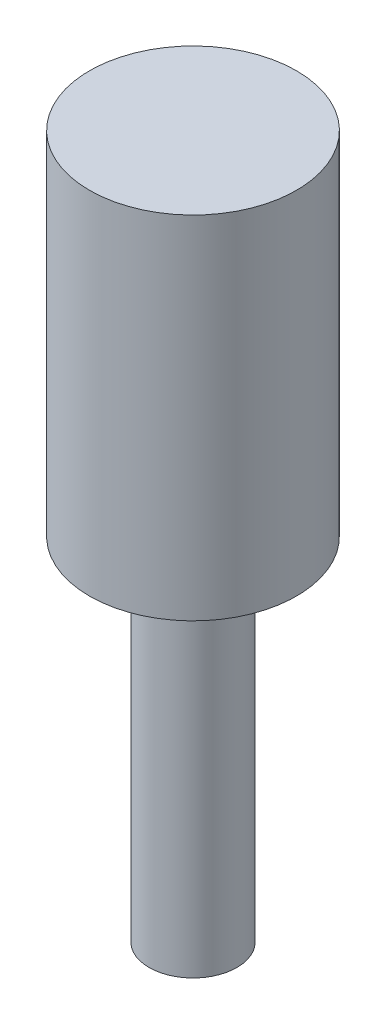
ISO-10303-21;
HEADER;
FILE_DESCRIPTION(('STEP AP214'),'2;1');
FILE_NAME('part.step','',(''),(''),'','','');
FILE_SCHEMA(('AUTOMOTIVE_DESIGN { 1 0 10303 214 1 1 1 1 }'));
ENDSEC;
DATA;
#1=APPLICATION_CONTEXT('core data for automotive mechanical design processes');
#2=APPLICATION_PROTOCOL_DEFINITION('international standard','automotive_design',2000,#1);
#3=PRODUCT_CONTEXT('',#1,'mechanical');
#4=PRODUCT('Part','Part','',(#3));
#5=PRODUCT_RELATED_PRODUCT_CATEGORY('part','',(#4));
#6=PRODUCT_DEFINITION_FORMATION('','',#4);
#7=PRODUCT_DEFINITION_CONTEXT('part definition',#1,'design');
#8=PRODUCT_DEFINITION('design','',#6,#7);
#9=PRODUCT_DEFINITION_SHAPE('','',#8);
#10=(LENGTH_UNIT() NAMED_UNIT(*) SI_UNIT(.MILLI.,.METRE.));
#11=(NAMED_UNIT(*) PLANE_ANGLE_UNIT() SI_UNIT($,.RADIAN.));
#12=(NAMED_UNIT(*) SI_UNIT($,.STERADIAN.) SOLID_ANGLE_UNIT());
#13=UNCERTAINTY_MEASURE_WITH_UNIT(LENGTH_MEASURE(1.E-05),#10,'distance_accuracy_value','');
#14=(GEOMETRIC_REPRESENTATION_CONTEXT(3) GLOBAL_UNCERTAINTY_ASSIGNED_CONTEXT((#13)) GLOBAL_UNIT_ASSIGNED_CONTEXT((#10,
#11,#12)) REPRESENTATION_CONTEXT('',''));
#15=CARTESIAN_POINT('',(0.,0.,0.));
#16=DIRECTION('',(0.,0.,1.));
#17=DIRECTION('',(1.,0.,0.));
#18=AXIS2_PLACEMENT_3D('',#15,#16,#17);
#19=CARTESIAN_POINT('',(0.,25.4,0.));
#20=DIRECTION('',(0.,-1.,0.));
#21=DIRECTION('',(0.,0.,-1.));
#22=AXIS2_PLACEMENT_3D('',#19,#20,#21);
#23=CYLINDRICAL_SURFACE('',#22,3.175);
#24=CARTESIAN_POINT('',(0.,25.4,0.));
#25=DIRECTION('',(0.,1.,0.));
#26=DIRECTION('',(0.,0.,1.));
#27=AXIS2_PLACEMENT_3D('',#24,#25,#26);
#28=CIRCLE('',#27,3.175);
#29=CARTESIAN_POINT('',(0.,25.4,3.175));
#30=VERTEX_POINT('',#29);
#31=EDGE_CURVE('E10',#30,#30,#28,.T.);
#32=ORIENTED_EDGE('',*,*,#31,.F.);
#33=EDGE_LOOP('',(#32));
#34=FACE_BOUND('',#33,.T.);
#35=CARTESIAN_POINT('',(0.,0.,0.));
#36=DIRECTION('',(0.,1.,0.));
#37=DIRECTION('',(0.,0.,1.));
#38=AXIS2_PLACEMENT_3D('',#35,#36,#37);
#39=CIRCLE('',#38,3.175);
#40=CARTESIAN_POINT('',(0.,0.,3.175));
#41=VERTEX_POINT('',#40);
#42=EDGE_CURVE('E46',#41,#41,#39,.T.);
#43=ORIENTED_EDGE('',*,*,#42,.T.);
#44=EDGE_LOOP('',(#43));
#45=FACE_BOUND('',#44,.T.);
#46=ADVANCED_FACE('F43',(#34,#45),#23,.T.);
#47=CARTESIAN_POINT('',(0.,0.,0.));
#48=DIRECTION('',(0.,1.,0.));
#49=DIRECTION('',(0.,0.,1.));
#50=AXIS2_PLACEMENT_3D('',#47,#48,#49);
#51=PLANE('',#50);
#52=ORIENTED_EDGE('',*,*,#42,.F.);
#53=EDGE_LOOP('',(#52));
#54=FACE_BOUND('',#53,.T.);
#55=ADVANCED_FACE('F70',(#54),#51,.F.);
#56=CARTESIAN_POINT('',(0.,50.8,0.));
#57=DIRECTION('',(0.,-1.,0.));
#58=DIRECTION('',(0.,0.,-1.));
#59=AXIS2_PLACEMENT_3D('',#56,#57,#58);
#60=CYLINDRICAL_SURFACE('',#59,7.48356829816003);
#61=CARTESIAN_POINT('',(0.,50.8,0.));
#62=DIRECTION('',(0.,1.,0.));
#63=DIRECTION('',(0.,0.,1.));
#64=AXIS2_PLACEMENT_3D('',#61,#62,#63);
#65=CIRCLE('',#64,7.48356829816003);
#66=CARTESIAN_POINT('',(0.,50.8,7.48356829816003));
#67=VERTEX_POINT('',#66);
#68=EDGE_CURVE('E55',#67,#67,#65,.T.);
#69=ORIENTED_EDGE('',*,*,#68,.F.);
#70=EDGE_LOOP('',(#69));
#71=FACE_BOUND('',#70,.T.);
#72=CARTESIAN_POINT('',(0.,25.4,0.));
#73=DIRECTION('',(0.,1.,0.));
#74=DIRECTION('',(0.,0.,1.));
#75=AXIS2_PLACEMENT_3D('',#72,#73,#74);
#76=CIRCLE('',#75,7.48356829816003);
#77=CARTESIAN_POINT('',(0.,25.4,7.48356829816003));
#78=VERTEX_POINT('',#77);
#79=EDGE_CURVE('E57',#78,#78,#76,.T.);
#80=ORIENTED_EDGE('',*,*,#79,.T.);
#81=EDGE_LOOP('',(#80));
#82=FACE_BOUND('',#81,.T.);
#83=ADVANCED_FACE('F67',(#71,#82),#60,.T.);
#84=CARTESIAN_POINT('',(0.,50.8,0.));
#85=DIRECTION('',(0.,1.,0.));
#86=DIRECTION('',(0.,0.,1.));
#87=AXIS2_PLACEMENT_3D('',#84,#85,#86);
#88=PLANE('',#87);
#89=ORIENTED_EDGE('',*,*,#68,.T.);
#90=EDGE_LOOP('',(#89));
#91=FACE_BOUND('',#90,.T.);
#92=ADVANCED_FACE('F65',(#91),#88,.T.);
#93=CARTESIAN_POINT('',(0.,25.4,0.));
#94=DIRECTION('',(0.,1.,0.));
#95=DIRECTION('',(0.,0.,1.));
#96=AXIS2_PLACEMENT_3D('',#93,#94,#95);
#97=PLANE('',#96);
#98=ORIENTED_EDGE('',*,*,#31,.T.);
#99=EDGE_LOOP('',(#98));
#100=FACE_BOUND('',#99,.T.);
#101=ORIENTED_EDGE('',*,*,#79,.F.);
#102=EDGE_LOOP('',(#101));
#103=FACE_BOUND('',#102,.T.);
#104=ADVANCED_FACE('F74',(#100,#103),#97,.F.);
#105=CLOSED_SHELL('',(#46,#55,#83,#92,#104));
#106=MANIFOLD_SOLID_BREP('B2',#105);
#107=ADVANCED_BREP_SHAPE_REPRESENTATION('',(#18,#106),#14);
#108=SHAPE_DEFINITION_REPRESENTATION(#9,#107);
ENDSEC;
END-ISO-10303-21;
